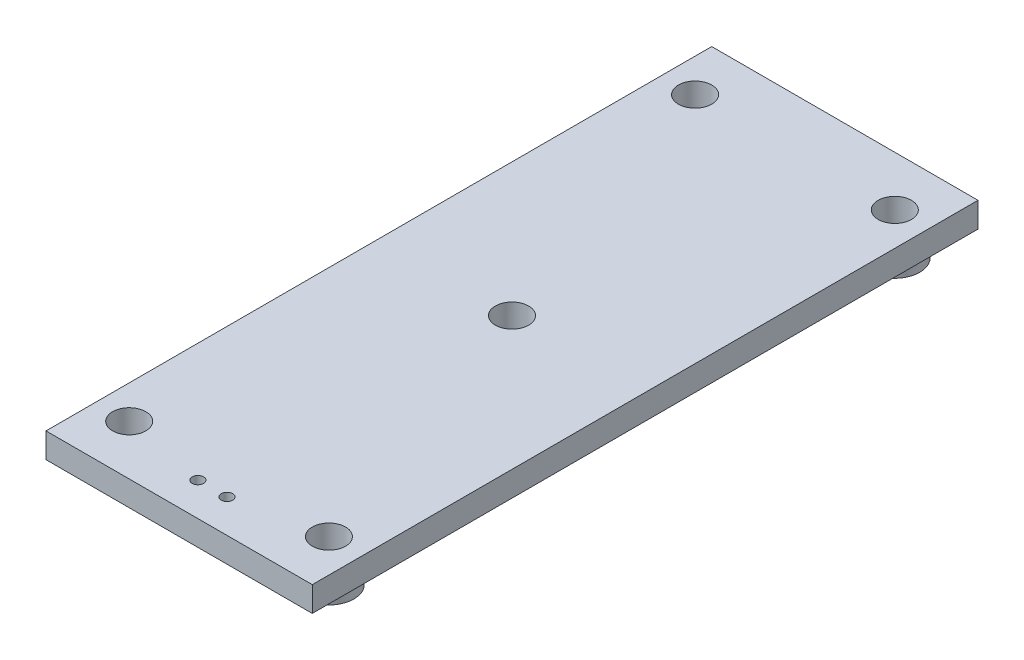
ISO-10303-21;
HEADER;
FILE_DESCRIPTION(('STEP AP214'),'2;1');
FILE_NAME('part.step','',(''),(''),'','','');
FILE_SCHEMA(('AUTOMOTIVE_DESIGN { 1 0 10303 214 1 1 1 1 }'));
ENDSEC;
DATA;
#1=APPLICATION_CONTEXT('core data for automotive mechanical design processes');
#2=APPLICATION_PROTOCOL_DEFINITION('international standard','automotive_design',2000,#1);
#3=PRODUCT_CONTEXT('',#1,'mechanical');
#4=PRODUCT('Part','Part','',(#3));
#5=PRODUCT_RELATED_PRODUCT_CATEGORY('part','',(#4));
#6=PRODUCT_DEFINITION_FORMATION('','',#4);
#7=PRODUCT_DEFINITION_CONTEXT('part definition',#1,'design');
#8=PRODUCT_DEFINITION('design','',#6,#7);
#9=PRODUCT_DEFINITION_SHAPE('','',#8);
#10=(LENGTH_UNIT() NAMED_UNIT(*) SI_UNIT(.MILLI.,.METRE.));
#11=(NAMED_UNIT(*) PLANE_ANGLE_UNIT() SI_UNIT($,.RADIAN.));
#12=(NAMED_UNIT(*) SI_UNIT($,.STERADIAN.) SOLID_ANGLE_UNIT());
#13=UNCERTAINTY_MEASURE_WITH_UNIT(LENGTH_MEASURE(1.E-05),#10,'distance_accuracy_value','');
#14=(GEOMETRIC_REPRESENTATION_CONTEXT(3) GLOBAL_UNCERTAINTY_ASSIGNED_CONTEXT((#13)) GLOBAL_UNIT_ASSIGNED_CONTEXT((#10,
#11,#12)) REPRESENTATION_CONTEXT('',''));
#15=CARTESIAN_POINT('',(0.,0.,0.));
#16=DIRECTION('',(0.,0.,1.));
#17=DIRECTION('',(1.,0.,0.));
#18=AXIS2_PLACEMENT_3D('',#15,#16,#17);
#19=CARTESIAN_POINT('',(101.6,0.,0.));
#20=DIRECTION('',(0.,-1.,0.));
#21=DIRECTION('',(0.,0.,-1.));
#22=AXIS2_PLACEMENT_3D('',#19,#20,#21);
#23=PLANE('',#22);
#24=CARTESIAN_POINT('',(-11.1125000000003,0.,482.6));
#25=DIRECTION('',(0.,-1.,0.));
#26=DIRECTION('',(0.,0.,-1.));
#27=AXIS2_PLACEMENT_3D('',#24,#25,#26);
#28=CIRCLE('',#27,4.365625);
#29=CARTESIAN_POINT('',(-11.1125000000003,0.,478.234375));
#30=VERTEX_POINT('',#29);
#31=EDGE_CURVE('E227',#30,#30,#28,.T.);
#32=ORIENTED_EDGE('',*,*,#31,.F.);
#33=EDGE_LOOP('',(#32));
#34=FACE_BOUND('',#33,.T.);
#35=CARTESIAN_POINT('',(11.1124999999996,0.,482.6));
#36=DIRECTION('',(0.,-1.,0.));
#37=DIRECTION('',(0.,0.,-1.));
#38=AXIS2_PLACEMENT_3D('',#35,#36,#37);
#39=CIRCLE('',#38,4.365625);
#40=CARTESIAN_POINT('',(11.1124999999996,0.,478.234375));
#41=VERTEX_POINT('',#40);
#42=EDGE_CURVE('E229',#41,#41,#39,.T.);
#43=ORIENTED_EDGE('',*,*,#42,.F.);
#44=EDGE_LOOP('',(#43));
#45=FACE_BOUND('',#44,.T.);
#46=CARTESIAN_POINT('',(0.,0.,254.));
#47=DIRECTION('',(0.,-1.,0.));
#48=DIRECTION('',(0.,0.,-1.));
#49=AXIS2_PLACEMENT_3D('',#46,#47,#48);
#50=CIRCLE('',#49,12.7);
#51=CARTESIAN_POINT('',(0.,0.,241.3));
#52=VERTEX_POINT('',#51);
#53=EDGE_CURVE('E240',#52,#52,#50,.T.);
#54=ORIENTED_EDGE('',*,*,#53,.F.);
#55=EDGE_LOOP('',(#54));
#56=FACE_BOUND('',#55,.T.);
#57=CARTESIAN_POINT('',(-76.2000000000001,0.,469.9));
#58=DIRECTION('',(0.,-1.,0.));
#59=DIRECTION('',(0.,0.,-1.));
#60=AXIS2_PLACEMENT_3D('',#57,#58,#59);
#61=CIRCLE('',#60,19.05);
#62=CARTESIAN_POINT('',(-76.2000000000001,0.,450.85));
#63=VERTEX_POINT('',#62);
#64=EDGE_CURVE('E11',#63,#63,#61,.T.);
#65=ORIENTED_EDGE('',*,*,#64,.F.);
#66=EDGE_LOOP('',(#65));
#67=FACE_BOUND('',#66,.T.);
#68=CARTESIAN_POINT('',(76.1999999999999,0.,469.9));
#69=DIRECTION('',(0.,-1.,0.));
#70=DIRECTION('',(0.,0.,-1.));
#71=AXIS2_PLACEMENT_3D('',#68,#69,#70);
#72=CIRCLE('',#71,19.05);
#73=CARTESIAN_POINT('',(76.1999999999999,0.,450.85));
#74=VERTEX_POINT('',#73);
#75=EDGE_CURVE('E138',#74,#74,#72,.T.);
#76=ORIENTED_EDGE('',*,*,#75,.F.);
#77=EDGE_LOOP('',(#76));
#78=FACE_BOUND('',#77,.T.);
#79=DIRECTION('',(0.,0.,1.));
#80=VECTOR('',#79,1.);
#81=CARTESIAN_POINT('',(101.6,0.,0.));
#82=LINE('',#81,#80);
#83=CARTESIAN_POINT('',(101.6,0.,0.));
#84=VERTEX_POINT('',#83);
#85=CARTESIAN_POINT('',(101.6,0.,508.));
#86=VERTEX_POINT('',#85);
#87=EDGE_CURVE('E102',#84,#86,#82,.T.);
#88=ORIENTED_EDGE('',*,*,#87,.T.);
#89=DIRECTION('',(1.,0.,0.));
#90=VECTOR('',#89,1.);
#91=CARTESIAN_POINT('',(-101.6,0.,508.));
#92=LINE('',#91,#90);
#93=CARTESIAN_POINT('',(-101.6,0.,508.));
#94=VERTEX_POINT('',#93);
#95=EDGE_CURVE('E105',#94,#86,#92,.T.);
#96=ORIENTED_EDGE('',*,*,#95,.F.);
#97=DIRECTION('',(0.,0.,-1.));
#98=VECTOR('',#97,1.);
#99=CARTESIAN_POINT('',(-101.6,0.,508.));
#100=LINE('',#99,#98);
#101=CARTESIAN_POINT('',(-101.6,0.,0.));
#102=VERTEX_POINT('',#101);
#103=EDGE_CURVE('E87',#94,#102,#100,.T.);
#104=ORIENTED_EDGE('',*,*,#103,.T.);
#105=DIRECTION('',(-1.,0.,0.));
#106=VECTOR('',#105,1.);
#107=CARTESIAN_POINT('',(101.6,0.,0.));
#108=LINE('',#107,#106);
#109=EDGE_CURVE('E109',#84,#102,#108,.T.);
#110=ORIENTED_EDGE('',*,*,#109,.F.);
#111=EDGE_LOOP('',(#88,#96,#104,#110));
#112=FACE_BOUND('',#111,.T.);
#113=CARTESIAN_POINT('',(76.1999999999999,0.,38.1));
#114=DIRECTION('',(0.,-1.,0.));
#115=DIRECTION('',(0.,0.,-1.));
#116=AXIS2_PLACEMENT_3D('',#113,#114,#115);
#117=CIRCLE('',#116,19.05);
#118=CARTESIAN_POINT('',(76.1999999999999,0.,19.05));
#119=VERTEX_POINT('',#118);
#120=EDGE_CURVE('E43',#119,#119,#117,.T.);
#121=ORIENTED_EDGE('',*,*,#120,.F.);
#122=EDGE_LOOP('',(#121));
#123=FACE_BOUND('',#122,.T.);
#124=CARTESIAN_POINT('',(-76.2000000000001,0.,38.1));
#125=DIRECTION('',(0.,-1.,0.));
#126=DIRECTION('',(0.,0.,-1.));
#127=AXIS2_PLACEMENT_3D('',#124,#125,#126);
#128=CIRCLE('',#127,19.05);
#129=CARTESIAN_POINT('',(-76.2000000000001,0.,19.05));
#130=VERTEX_POINT('',#129);
#131=EDGE_CURVE('E124',#130,#130,#128,.T.);
#132=ORIENTED_EDGE('',*,*,#131,.F.);
#133=EDGE_LOOP('',(#132));
#134=FACE_BOUND('',#133,.T.);
#135=ADVANCED_FACE('F34',(#34,#45,#56,#67,#78,#112,#123,#134),#23,.T.);
#136=CARTESIAN_POINT('',(101.6,19.05,0.));
#137=DIRECTION('',(1.,0.,0.));
#138=DIRECTION('',(0.,0.,-1.));
#139=AXIS2_PLACEMENT_3D('',#136,#137,#138);
#140=PLANE('',#139);
#141=ORIENTED_EDGE('',*,*,#87,.F.);
#142=DIRECTION('',(0.,-1.,0.));
#143=VECTOR('',#142,1.);
#144=CARTESIAN_POINT('',(101.6,19.05,0.));
#145=LINE('',#144,#143);
#146=CARTESIAN_POINT('',(101.6,19.05,0.));
#147=VERTEX_POINT('',#146);
#148=EDGE_CURVE('E51',#147,#84,#145,.T.);
#149=ORIENTED_EDGE('',*,*,#148,.F.);
#150=DIRECTION('',(0.,0.,1.));
#151=VECTOR('',#150,1.);
#152=CARTESIAN_POINT('',(101.6,19.05,0.));
#153=LINE('',#152,#151);
#154=CARTESIAN_POINT('',(101.6,19.05,508.));
#155=VERTEX_POINT('',#154);
#156=EDGE_CURVE('E94',#147,#155,#153,.T.);
#157=ORIENTED_EDGE('',*,*,#156,.T.);
#158=DIRECTION('',(0.,-1.,0.));
#159=VECTOR('',#158,1.);
#160=CARTESIAN_POINT('',(101.6,19.05,508.));
#161=LINE('',#160,#159);
#162=EDGE_CURVE('E91',#155,#86,#161,.T.);
#163=ORIENTED_EDGE('',*,*,#162,.T.);
#164=EDGE_LOOP('',(#141,#149,#157,#163));
#165=FACE_BOUND('',#164,.T.);
#166=ADVANCED_FACE('F36',(#165),#140,.T.);
#167=CARTESIAN_POINT('',(101.6,19.05,0.));
#168=DIRECTION('',(0.,0.,1.));
#169=DIRECTION('',(1.,0.,0.));
#170=AXIS2_PLACEMENT_3D('',#167,#168,#169);
#171=PLANE('',#170);
#172=ORIENTED_EDGE('',*,*,#109,.T.);
#173=DIRECTION('',(0.,-1.,0.));
#174=VECTOR('',#173,1.);
#175=CARTESIAN_POINT('',(-101.6,19.05,0.));
#176=LINE('',#175,#174);
#177=CARTESIAN_POINT('',(-101.6,19.05,0.));
#178=VERTEX_POINT('',#177);
#179=EDGE_CURVE('E69',#178,#102,#176,.T.);
#180=ORIENTED_EDGE('',*,*,#179,.F.);
#181=DIRECTION('',(-1.,0.,0.));
#182=VECTOR('',#181,1.);
#183=CARTESIAN_POINT('',(101.6,19.05,0.));
#184=LINE('',#183,#182);
#185=EDGE_CURVE('E97',#147,#178,#184,.T.);
#186=ORIENTED_EDGE('',*,*,#185,.F.);
#187=ORIENTED_EDGE('',*,*,#148,.T.);
#188=EDGE_LOOP('',(#172,#180,#186,#187));
#189=FACE_BOUND('',#188,.T.);
#190=ADVANCED_FACE('F143',(#189),#171,.F.);
#191=CARTESIAN_POINT('',(-101.6,19.05,508.));
#192=DIRECTION('',(-1.,0.,0.));
#193=DIRECTION('',(0.,0.,1.));
#194=AXIS2_PLACEMENT_3D('',#191,#192,#193);
#195=PLANE('',#194);
#196=ORIENTED_EDGE('',*,*,#103,.F.);
#197=DIRECTION('',(0.,-1.,0.));
#198=VECTOR('',#197,1.);
#199=CARTESIAN_POINT('',(-101.6,19.05,508.));
#200=LINE('',#199,#198);
#201=CARTESIAN_POINT('',(-101.6,19.05,508.));
#202=VERTEX_POINT('',#201);
#203=EDGE_CURVE('E83',#202,#94,#200,.T.);
#204=ORIENTED_EDGE('',*,*,#203,.F.);
#205=DIRECTION('',(0.,0.,-1.));
#206=VECTOR('',#205,1.);
#207=CARTESIAN_POINT('',(-101.6,19.05,508.));
#208=LINE('',#207,#206);
#209=EDGE_CURVE('E85',#202,#178,#208,.T.);
#210=ORIENTED_EDGE('',*,*,#209,.T.);
#211=ORIENTED_EDGE('',*,*,#179,.T.);
#212=EDGE_LOOP('',(#196,#204,#210,#211));
#213=FACE_BOUND('',#212,.T.);
#214=ADVANCED_FACE('F84',(#213),#195,.T.);
#215=CARTESIAN_POINT('',(-101.6,19.05,508.));
#216=DIRECTION('',(0.,0.,-1.));
#217=DIRECTION('',(-1.,0.,0.));
#218=AXIS2_PLACEMENT_3D('',#215,#216,#217);
#219=PLANE('',#218);
#220=ORIENTED_EDGE('',*,*,#95,.T.);
#221=ORIENTED_EDGE('',*,*,#162,.F.);
#222=DIRECTION('',(1.,0.,0.));
#223=VECTOR('',#222,1.);
#224=CARTESIAN_POINT('',(-101.6,19.05,508.));
#225=LINE('',#224,#223);
#226=EDGE_CURVE('E80',#202,#155,#225,.T.);
#227=ORIENTED_EDGE('',*,*,#226,.F.);
#228=ORIENTED_EDGE('',*,*,#203,.T.);
#229=EDGE_LOOP('',(#220,#221,#227,#228));
#230=FACE_BOUND('',#229,.T.);
#231=ADVANCED_FACE('F93',(#230),#219,.F.);
#232=CARTESIAN_POINT('',(101.6,19.05,0.));
#233=DIRECTION('',(0.,-1.,0.));
#234=DIRECTION('',(0.,0.,-1.));
#235=AXIS2_PLACEMENT_3D('',#232,#233,#234);
#236=PLANE('',#235);
#237=CARTESIAN_POINT('',(-11.1125000000003,19.05,482.6));
#238=DIRECTION('',(0.,-1.,0.));
#239=DIRECTION('',(0.,0.,-1.));
#240=AXIS2_PLACEMENT_3D('',#237,#238,#239);
#241=CIRCLE('',#240,4.365625);
#242=CARTESIAN_POINT('',(-11.1125000000003,19.05,478.234375));
#243=VERTEX_POINT('',#242);
#244=EDGE_CURVE('E224',#243,#243,#241,.T.);
#245=ORIENTED_EDGE('',*,*,#244,.T.);
#246=EDGE_LOOP('',(#245));
#247=FACE_BOUND('',#246,.T.);
#248=CARTESIAN_POINT('',(11.1124999999996,19.05,482.6));
#249=DIRECTION('',(0.,-1.,0.));
#250=DIRECTION('',(0.,0.,-1.));
#251=AXIS2_PLACEMENT_3D('',#248,#249,#250);
#252=CIRCLE('',#251,4.365625);
#253=CARTESIAN_POINT('',(11.1124999999996,19.05,478.234375));
#254=VERTEX_POINT('',#253);
#255=EDGE_CURVE('E232',#254,#254,#252,.T.);
#256=ORIENTED_EDGE('',*,*,#255,.T.);
#257=EDGE_LOOP('',(#256));
#258=FACE_BOUND('',#257,.T.);
#259=CARTESIAN_POINT('',(0.,19.05,254.));
#260=DIRECTION('',(0.,1.,0.));
#261=DIRECTION('',(0.,0.,1.));
#262=AXIS2_PLACEMENT_3D('',#259,#260,#261);
#263=CIRCLE('',#262,12.7);
#264=CARTESIAN_POINT('',(0.,19.05,266.7));
#265=VERTEX_POINT('',#264);
#266=EDGE_CURVE('E235',#265,#265,#263,.T.);
#267=ORIENTED_EDGE('',*,*,#266,.F.);
#268=EDGE_LOOP('',(#267));
#269=FACE_BOUND('',#268,.T.);
#270=CARTESIAN_POINT('',(-76.2000000000001,19.05,38.1));
#271=DIRECTION('',(0.,-1.,0.));
#272=DIRECTION('',(0.,0.,-1.));
#273=AXIS2_PLACEMENT_3D('',#270,#271,#272);
#274=CIRCLE('',#273,12.7);
#275=CARTESIAN_POINT('',(-76.2000000000001,19.05,25.4));
#276=VERTEX_POINT('',#275);
#277=EDGE_CURVE('E244',#276,#276,#274,.T.);
#278=ORIENTED_EDGE('',*,*,#277,.T.);
#279=EDGE_LOOP('',(#278));
#280=FACE_BOUND('',#279,.T.);
#281=CARTESIAN_POINT('',(76.1999999999999,19.05,38.1));
#282=DIRECTION('',(0.,-1.,0.));
#283=DIRECTION('',(0.,0.,-1.));
#284=AXIS2_PLACEMENT_3D('',#281,#282,#283);
#285=CIRCLE('',#284,12.7);
#286=CARTESIAN_POINT('',(76.1999999999999,19.05,25.4));
#287=VERTEX_POINT('',#286);
#288=EDGE_CURVE('E250',#287,#287,#285,.T.);
#289=ORIENTED_EDGE('',*,*,#288,.T.);
#290=EDGE_LOOP('',(#289));
#291=FACE_BOUND('',#290,.T.);
#292=CARTESIAN_POINT('',(-76.2000000000001,19.05,469.9));
#293=DIRECTION('',(0.,-1.,0.));
#294=DIRECTION('',(0.,0.,-1.));
#295=AXIS2_PLACEMENT_3D('',#292,#293,#294);
#296=CIRCLE('',#295,12.7);
#297=CARTESIAN_POINT('',(-76.2000000000001,19.05,457.2));
#298=VERTEX_POINT('',#297);
#299=EDGE_CURVE('E256',#298,#298,#296,.T.);
#300=ORIENTED_EDGE('',*,*,#299,.T.);
#301=EDGE_LOOP('',(#300));
#302=FACE_BOUND('',#301,.T.);
#303=CARTESIAN_POINT('',(76.1999999999999,19.05,469.9));
#304=DIRECTION('',(0.,-1.,0.));
#305=DIRECTION('',(0.,0.,-1.));
#306=AXIS2_PLACEMENT_3D('',#303,#304,#305);
#307=CIRCLE('',#306,12.7);
#308=CARTESIAN_POINT('',(76.1999999999999,19.05,457.2));
#309=VERTEX_POINT('',#308);
#310=EDGE_CURVE('E133',#309,#309,#307,.T.);
#311=ORIENTED_EDGE('',*,*,#310,.T.);
#312=EDGE_LOOP('',(#311));
#313=FACE_BOUND('',#312,.T.);
#314=ORIENTED_EDGE('',*,*,#156,.F.);
#315=ORIENTED_EDGE('',*,*,#185,.T.);
#316=ORIENTED_EDGE('',*,*,#209,.F.);
#317=ORIENTED_EDGE('',*,*,#226,.T.);
#318=EDGE_LOOP('',(#314,#315,#316,#317));
#319=FACE_BOUND('',#318,.T.);
#320=ADVANCED_FACE('F96',(#247,#258,#269,#280,#291,#302,#313,#319),#236,.F.);
#321=CARTESIAN_POINT('',(76.1999999999999,-12.7,469.9));
#322=DIRECTION('',(0.,1.,0.));
#323=DIRECTION('',(0.,0.,1.));
#324=AXIS2_PLACEMENT_3D('',#321,#322,#323);
#325=CYLINDRICAL_SURFACE('',#324,19.05);
#326=CARTESIAN_POINT('',(76.1999999999999,-12.7,469.9));
#327=DIRECTION('',(0.,-1.,0.));
#328=DIRECTION('',(0.,0.,-1.));
#329=AXIS2_PLACEMENT_3D('',#326,#327,#328);
#330=CIRCLE('',#329,19.05);
#331=CARTESIAN_POINT('',(76.1999999999999,-12.7,450.85));
#332=VERTEX_POINT('',#331);
#333=EDGE_CURVE('E106',#332,#332,#330,.T.);
#334=ORIENTED_EDGE('',*,*,#333,.F.);
#335=EDGE_LOOP('',(#334));
#336=FACE_BOUND('',#335,.T.);
#337=ORIENTED_EDGE('',*,*,#75,.T.);
#338=EDGE_LOOP('',(#337));
#339=FACE_BOUND('',#338,.T.);
#340=ADVANCED_FACE('F156',(#336,#339),#325,.T.);
#341=CARTESIAN_POINT('',(76.1999999999999,-12.7,469.9));
#342=DIRECTION('',(0.,-1.,0.));
#343=DIRECTION('',(0.,0.,-1.));
#344=AXIS2_PLACEMENT_3D('',#341,#342,#343);
#345=PLANE('',#344);
#346=CARTESIAN_POINT('',(76.1999999999999,-12.7,469.9));
#347=DIRECTION('',(0.,-1.,0.));
#348=DIRECTION('',(0.,0.,-1.));
#349=AXIS2_PLACEMENT_3D('',#346,#347,#348);
#350=CIRCLE('',#349,12.7);
#351=CARTESIAN_POINT('',(76.1999999999999,-12.7,457.2));
#352=VERTEX_POINT('',#351);
#353=EDGE_CURVE('E259',#352,#352,#350,.T.);
#354=ORIENTED_EDGE('',*,*,#353,.F.);
#355=EDGE_LOOP('',(#354));
#356=FACE_BOUND('',#355,.T.);
#357=ORIENTED_EDGE('',*,*,#333,.T.);
#358=EDGE_LOOP('',(#357));
#359=FACE_BOUND('',#358,.T.);
#360=ADVANCED_FACE('F161',(#356,#359),#345,.T.);
#361=CARTESIAN_POINT('',(76.1999999999999,-12.7,38.1));
#362=DIRECTION('',(0.,1.,0.));
#363=DIRECTION('',(0.,0.,1.));
#364=AXIS2_PLACEMENT_3D('',#361,#362,#363);
#365=CYLINDRICAL_SURFACE('',#364,19.05);
#366=CARTESIAN_POINT('',(76.1999999999999,-12.7,38.1));
#367=DIRECTION('',(0.,1.,0.));
#368=DIRECTION('',(0.,0.,1.));
#369=AXIS2_PLACEMENT_3D('',#366,#367,#368);
#370=CIRCLE('',#369,19.05);
#371=CARTESIAN_POINT('',(76.1999999999999,-12.7,57.15));
#372=VERTEX_POINT('',#371);
#373=EDGE_CURVE('E130',#372,#372,#370,.T.);
#374=ORIENTED_EDGE('',*,*,#373,.T.);
#375=EDGE_LOOP('',(#374));
#376=FACE_BOUND('',#375,.T.);
#377=ORIENTED_EDGE('',*,*,#120,.T.);
#378=EDGE_LOOP('',(#377));
#379=FACE_BOUND('',#378,.T.);
#380=ADVANCED_FACE('F116',(#376,#379),#365,.T.);
#381=CARTESIAN_POINT('',(76.1999999999999,-12.7,38.1));
#382=DIRECTION('',(0.,1.,0.));
#383=DIRECTION('',(0.,0.,1.));
#384=AXIS2_PLACEMENT_3D('',#381,#382,#383);
#385=PLANE('',#384);
#386=CARTESIAN_POINT('',(76.1999999999999,-12.7,38.1));
#387=DIRECTION('',(0.,-1.,0.));
#388=DIRECTION('',(0.,0.,-1.));
#389=AXIS2_PLACEMENT_3D('',#386,#387,#388);
#390=CIRCLE('',#389,12.7);
#391=CARTESIAN_POINT('',(76.1999999999999,-12.7,25.4));
#392=VERTEX_POINT('',#391);
#393=EDGE_CURVE('E247',#392,#392,#390,.T.);
#394=ORIENTED_EDGE('',*,*,#393,.F.);
#395=EDGE_LOOP('',(#394));
#396=FACE_BOUND('',#395,.T.);
#397=ORIENTED_EDGE('',*,*,#373,.F.);
#398=EDGE_LOOP('',(#397));
#399=FACE_BOUND('',#398,.T.);
#400=ADVANCED_FACE('F172',(#396,#399),#385,.F.);
#401=CARTESIAN_POINT('',(-76.2000000000001,-12.7,38.1));
#402=DIRECTION('',(0.,1.,0.));
#403=DIRECTION('',(0.,0.,1.));
#404=AXIS2_PLACEMENT_3D('',#401,#402,#403);
#405=CYLINDRICAL_SURFACE('',#404,19.05);
#406=CARTESIAN_POINT('',(-76.2000000000001,-12.7,38.1));
#407=DIRECTION('',(0.,-1.,0.));
#408=DIRECTION('',(0.,0.,-1.));
#409=AXIS2_PLACEMENT_3D('',#406,#407,#408);
#410=CIRCLE('',#409,19.05);
#411=CARTESIAN_POINT('',(-76.2000000000001,-12.7,19.05));
#412=VERTEX_POINT('',#411);
#413=EDGE_CURVE('E126',#412,#412,#410,.T.);
#414=ORIENTED_EDGE('',*,*,#413,.F.);
#415=EDGE_LOOP('',(#414));
#416=FACE_BOUND('',#415,.T.);
#417=ORIENTED_EDGE('',*,*,#131,.T.);
#418=EDGE_LOOP('',(#417));
#419=FACE_BOUND('',#418,.T.);
#420=ADVANCED_FACE('F176',(#416,#419),#405,.T.);
#421=CARTESIAN_POINT('',(-76.2000000000001,-12.7,38.1));
#422=DIRECTION('',(0.,-1.,0.));
#423=DIRECTION('',(0.,0.,-1.));
#424=AXIS2_PLACEMENT_3D('',#421,#422,#423);
#425=PLANE('',#424);
#426=CARTESIAN_POINT('',(-76.2000000000001,-12.7,38.1));
#427=DIRECTION('',(0.,-1.,0.));
#428=DIRECTION('',(0.,0.,-1.));
#429=AXIS2_PLACEMENT_3D('',#426,#427,#428);
#430=CIRCLE('',#429,12.7);
#431=CARTESIAN_POINT('',(-76.2000000000001,-12.7,25.4));
#432=VERTEX_POINT('',#431);
#433=EDGE_CURVE('E243',#432,#432,#430,.T.);
#434=ORIENTED_EDGE('',*,*,#433,.F.);
#435=EDGE_LOOP('',(#434));
#436=FACE_BOUND('',#435,.T.);
#437=ORIENTED_EDGE('',*,*,#413,.T.);
#438=EDGE_LOOP('',(#437));
#439=FACE_BOUND('',#438,.T.);
#440=ADVANCED_FACE('F180',(#436,#439),#425,.T.);
#441=CARTESIAN_POINT('',(-76.2000000000001,-12.7,469.9));
#442=DIRECTION('',(0.,1.,0.));
#443=DIRECTION('',(0.,0.,1.));
#444=AXIS2_PLACEMENT_3D('',#441,#442,#443);
#445=CYLINDRICAL_SURFACE('',#444,19.05);
#446=CARTESIAN_POINT('',(-76.2000000000001,-12.7,469.9));
#447=DIRECTION('',(0.,1.,0.));
#448=DIRECTION('',(0.,0.,1.));
#449=AXIS2_PLACEMENT_3D('',#446,#447,#448);
#450=CIRCLE('',#449,19.05);
#451=CARTESIAN_POINT('',(-76.2000000000001,-12.7,488.95));
#452=VERTEX_POINT('',#451);
#453=EDGE_CURVE('E127',#452,#452,#450,.T.);
#454=ORIENTED_EDGE('',*,*,#453,.T.);
#455=EDGE_LOOP('',(#454));
#456=FACE_BOUND('',#455,.T.);
#457=ORIENTED_EDGE('',*,*,#64,.T.);
#458=EDGE_LOOP('',(#457));
#459=FACE_BOUND('',#458,.T.);
#460=ADVANCED_FACE('F184',(#456,#459),#445,.T.);
#461=CARTESIAN_POINT('',(-76.2000000000001,-12.7,469.9));
#462=DIRECTION('',(0.,1.,0.));
#463=DIRECTION('',(0.,0.,1.));
#464=AXIS2_PLACEMENT_3D('',#461,#462,#463);
#465=PLANE('',#464);
#466=CARTESIAN_POINT('',(-76.2000000000001,-12.7,469.9));
#467=DIRECTION('',(0.,-1.,0.));
#468=DIRECTION('',(0.,0.,-1.));
#469=AXIS2_PLACEMENT_3D('',#466,#467,#468);
#470=CIRCLE('',#469,12.7);
#471=CARTESIAN_POINT('',(-76.2000000000001,-12.7,457.2));
#472=VERTEX_POINT('',#471);
#473=EDGE_CURVE('E253',#472,#472,#470,.T.);
#474=ORIENTED_EDGE('',*,*,#473,.F.);
#475=EDGE_LOOP('',(#474));
#476=FACE_BOUND('',#475,.T.);
#477=ORIENTED_EDGE('',*,*,#453,.F.);
#478=EDGE_LOOP('',(#477));
#479=FACE_BOUND('',#478,.T.);
#480=ADVANCED_FACE('F188',(#476,#479),#465,.F.);
#481=CARTESIAN_POINT('',(76.1999999999999,19.05,469.9));
#482=DIRECTION('',(0.,-1.,0.));
#483=DIRECTION('',(0.,0.,-1.));
#484=AXIS2_PLACEMENT_3D('',#481,#482,#483);
#485=CYLINDRICAL_SURFACE('',#484,12.7);
#486=ORIENTED_EDGE('',*,*,#310,.F.);
#487=EDGE_LOOP('',(#486));
#488=FACE_BOUND('',#487,.T.);
#489=ORIENTED_EDGE('',*,*,#353,.T.);
#490=EDGE_LOOP('',(#489));
#491=FACE_BOUND('',#490,.T.);
#492=ADVANCED_FACE('F192',(#488,#491),#485,.F.);
#493=CARTESIAN_POINT('',(-76.2000000000001,19.05,469.9));
#494=DIRECTION('',(0.,-1.,0.));
#495=DIRECTION('',(0.,0.,-1.));
#496=AXIS2_PLACEMENT_3D('',#493,#494,#495);
#497=CYLINDRICAL_SURFACE('',#496,12.7);
#498=ORIENTED_EDGE('',*,*,#299,.F.);
#499=EDGE_LOOP('',(#498));
#500=FACE_BOUND('',#499,.T.);
#501=ORIENTED_EDGE('',*,*,#473,.T.);
#502=EDGE_LOOP('',(#501));
#503=FACE_BOUND('',#502,.T.);
#504=ADVANCED_FACE('F196',(#500,#503),#497,.F.);
#505=CARTESIAN_POINT('',(76.1999999999999,19.05,38.1));
#506=DIRECTION('',(0.,-1.,0.));
#507=DIRECTION('',(0.,0.,-1.));
#508=AXIS2_PLACEMENT_3D('',#505,#506,#507);
#509=CYLINDRICAL_SURFACE('',#508,12.7);
#510=ORIENTED_EDGE('',*,*,#288,.F.);
#511=EDGE_LOOP('',(#510));
#512=FACE_BOUND('',#511,.T.);
#513=ORIENTED_EDGE('',*,*,#393,.T.);
#514=EDGE_LOOP('',(#513));
#515=FACE_BOUND('',#514,.T.);
#516=ADVANCED_FACE('F200',(#512,#515),#509,.F.);
#517=CARTESIAN_POINT('',(-76.2000000000001,19.05,38.1));
#518=DIRECTION('',(0.,-1.,0.));
#519=DIRECTION('',(0.,0.,-1.));
#520=AXIS2_PLACEMENT_3D('',#517,#518,#519);
#521=CYLINDRICAL_SURFACE('',#520,12.7);
#522=ORIENTED_EDGE('',*,*,#277,.F.);
#523=EDGE_LOOP('',(#522));
#524=FACE_BOUND('',#523,.T.);
#525=ORIENTED_EDGE('',*,*,#433,.T.);
#526=EDGE_LOOP('',(#525));
#527=FACE_BOUND('',#526,.T.);
#528=ADVANCED_FACE('F204',(#524,#527),#521,.F.);
#529=CARTESIAN_POINT('',(0.,-12.7,254.));
#530=DIRECTION('',(0.,1.,0.));
#531=DIRECTION('',(0.,0.,1.));
#532=AXIS2_PLACEMENT_3D('',#529,#530,#531);
#533=CYLINDRICAL_SURFACE('',#532,12.7);
#534=ORIENTED_EDGE('',*,*,#53,.T.);
#535=EDGE_LOOP('',(#534));
#536=FACE_BOUND('',#535,.T.);
#537=ORIENTED_EDGE('',*,*,#266,.T.);
#538=EDGE_LOOP('',(#537));
#539=FACE_BOUND('',#538,.T.);
#540=ADVANCED_FACE('F208',(#536,#539),#533,.F.);
#541=CARTESIAN_POINT('',(11.1124999999996,19.05,482.6));
#542=DIRECTION('',(0.,-1.,0.));
#543=DIRECTION('',(0.,0.,-1.));
#544=AXIS2_PLACEMENT_3D('',#541,#542,#543);
#545=CYLINDRICAL_SURFACE('',#544,4.365625);
#546=CARTESIAN_POINT('',(11.1124999999996,19.05,478.234375));
#547=CARTESIAN_POINT('',(11.1124999999996,18.8515625,478.234375));
#548=CARTESIAN_POINT('',(11.1124999999996,18.653125,478.234375));
#549=CARTESIAN_POINT('',(11.1124999999996,18.25625,478.234375));
#550=CARTESIAN_POINT('',(11.1124999999996,18.0578125,478.234375));
#551=CARTESIAN_POINT('',(11.1124999999996,17.6609375,478.234375));
#552=CARTESIAN_POINT('',(11.1124999999996,17.4625,478.234375));
#553=CARTESIAN_POINT('',(11.1124999999996,17.065625,478.234375));
#554=CARTESIAN_POINT('',(11.1124999999996,16.8671875,478.234375));
#555=CARTESIAN_POINT('',(11.1124999999996,16.4703125,478.234375));
#556=CARTESIAN_POINT('',(11.1124999999996,16.271875,478.234375));
#557=CARTESIAN_POINT('',(11.1124999999996,15.875,478.234375));
#558=CARTESIAN_POINT('',(11.1124999999996,15.6765625,478.234375));
#559=CARTESIAN_POINT('',(11.1124999999996,15.2796875,478.234375));
#560=CARTESIAN_POINT('',(11.1124999999996,15.08125,478.234375));
#561=CARTESIAN_POINT('',(11.1124999999996,14.684375,478.234375));
#562=CARTESIAN_POINT('',(11.1124999999996,14.4859375,478.234375));
#563=CARTESIAN_POINT('',(11.1124999999996,14.0890625,478.234375));
#564=CARTESIAN_POINT('',(11.1124999999996,13.890625,478.234375));
#565=CARTESIAN_POINT('',(11.1124999999996,13.49375,478.234375));
#566=CARTESIAN_POINT('',(11.1124999999996,13.2953125,478.234375));
#567=CARTESIAN_POINT('',(11.1124999999996,12.8984375,478.234375));
#568=CARTESIAN_POINT('',(11.1124999999996,12.7,478.234375));
#569=CARTESIAN_POINT('',(11.1124999999996,12.303125,478.234375));
#570=CARTESIAN_POINT('',(11.1124999999996,12.1046875,478.234375));
#571=CARTESIAN_POINT('',(11.1124999999996,11.7078125,478.234375));
#572=CARTESIAN_POINT('',(11.1124999999996,11.509375,478.234375));
#573=CARTESIAN_POINT('',(11.1124999999996,11.1125,478.234375));
#574=CARTESIAN_POINT('',(11.1124999999996,10.9140625,478.234375));
#575=CARTESIAN_POINT('',(11.1124999999996,10.5171875,478.234375));
#576=CARTESIAN_POINT('',(11.1124999999996,10.31875,478.234375));
#577=CARTESIAN_POINT('',(11.1124999999996,9.921875,478.234375));
#578=CARTESIAN_POINT('',(11.1124999999996,9.7234375,478.234375));
#579=CARTESIAN_POINT('',(11.1124999999996,9.3265625,478.234375));
#580=CARTESIAN_POINT('',(11.1124999999996,9.128125,478.234375));
#581=CARTESIAN_POINT('',(11.1124999999996,8.73125,478.234375));
#582=CARTESIAN_POINT('',(11.1124999999996,8.5328125,478.234375));
#583=CARTESIAN_POINT('',(11.1124999999996,8.1359375,478.234375));
#584=CARTESIAN_POINT('',(11.1124999999996,7.9375,478.234375));
#585=CARTESIAN_POINT('',(11.1124999999996,7.540625,478.234375));
#586=CARTESIAN_POINT('',(11.1124999999996,7.3421875,478.234375));
#587=CARTESIAN_POINT('',(11.1124999999996,6.9453125,478.234375));
#588=CARTESIAN_POINT('',(11.1124999999996,6.746875,478.234375));
#589=CARTESIAN_POINT('',(11.1124999999996,6.35,478.234375));
#590=CARTESIAN_POINT('',(11.1124999999996,6.1515625,478.234375));
#591=CARTESIAN_POINT('',(11.1124999999996,5.7546875,478.234375));
#592=CARTESIAN_POINT('',(11.1124999999996,5.55625,478.234375));
#593=CARTESIAN_POINT('',(11.1124999999996,5.159375,478.234375));
#594=CARTESIAN_POINT('',(11.1124999999996,4.9609375,478.234375));
#595=CARTESIAN_POINT('',(11.1124999999996,4.5640625,478.234375));
#596=CARTESIAN_POINT('',(11.1124999999996,4.365625,478.234375));
#597=CARTESIAN_POINT('',(11.1124999999996,3.96875,478.234375));
#598=CARTESIAN_POINT('',(11.1124999999996,3.7703125,478.234375));
#599=CARTESIAN_POINT('',(11.1124999999996,3.3734375,478.234375));
#600=CARTESIAN_POINT('',(11.1124999999996,3.175,478.234375));
#601=CARTESIAN_POINT('',(11.1124999999996,2.778125,478.234375));
#602=CARTESIAN_POINT('',(11.1124999999996,2.5796875,478.234375));
#603=CARTESIAN_POINT('',(11.1124999999996,2.1828125,478.234375));
#604=CARTESIAN_POINT('',(11.1124999999996,1.984375,478.234375));
#605=CARTESIAN_POINT('',(11.1124999999996,1.5875,478.234375));
#606=CARTESIAN_POINT('',(11.1124999999996,1.3890625,478.234375));
#607=CARTESIAN_POINT('',(11.1124999999996,0.992187500000001,478.234375));
#608=CARTESIAN_POINT('',(11.1124999999996,0.793750000000001,478.234375));
#609=CARTESIAN_POINT('',(11.1124999999996,0.396875,478.234375));
#610=CARTESIAN_POINT('',(11.1124999999996,0.1984375,478.234375));
#611=CARTESIAN_POINT('',(11.1124999999996,0.,478.234375));
#612=B_SPLINE_CURVE_WITH_KNOTS('',3,(#546,#547,#548,#549,#550,#551,#552,#553,#554,#555,#556,
#557,#558,#559,#560,#561,#562,#563,#564,#565,#566,#567,#568,#569,#570,#571,#572,#573,#574,#575,
#576,#577,#578,#579,#580,#581,#582,#583,#584,#585,#586,#587,#588,#589,#590,#591,#592,#593,#594,
#595,#596,#597,#598,#599,#600,#601,#602,#603,#604,#605,#606,#607,#608,#609,#610,#611),
.UNSPECIFIED.,.F.,.F.,(4,2,2,2,2,2,2,2,2,2,2,2,2,2,2,2,2,2,2,2,2,2,2,2,2,2,2,2,2,2,2,2,4),(0.,
0.5953125,1.190625,1.7859375,2.38125,2.9765625,3.571875,4.1671875,4.7625,5.3578125,5.953125,
6.5484375,7.14375,7.7390625,8.334375,8.9296875,9.525,10.1203125,10.715625,11.3109375,11.90625,
12.5015625,13.096875,13.6921875,14.2875,14.8828125,15.478125,16.0734375,16.66875,17.2640625,
17.859375,18.4546875,19.05),.UNSPECIFIED.);
#613=EDGE_CURVE('BSEAM212',#254,#41,#612,.T.);
#614=ORIENTED_EDGE('',*,*,#255,.F.);
#615=ORIENTED_EDGE('',*,*,#42,.T.);
#616=ORIENTED_EDGE('',*,*,#613,.T.);
#617=ORIENTED_EDGE('',*,*,#613,.F.);
#618=EDGE_LOOP('',(#614,#616,#615,#617));
#619=FACE_BOUND('',#618,.T.);
#620=ADVANCED_FACE('F212',(#619),#545,.F.);
#621=CARTESIAN_POINT('',(-11.1125000000003,19.05,482.6));
#622=DIRECTION('',(0.,-1.,0.));
#623=DIRECTION('',(0.,0.,-1.));
#624=AXIS2_PLACEMENT_3D('',#621,#622,#623);
#625=CYLINDRICAL_SURFACE('',#624,4.365625);
#626=CARTESIAN_POINT('',(-11.1125000000003,19.05,478.234375));
#627=CARTESIAN_POINT('',(-11.1125000000003,18.8515625,478.234375));
#628=CARTESIAN_POINT('',(-11.1125000000003,18.653125,478.234375));
#629=CARTESIAN_POINT('',(-11.1125000000003,18.25625,478.234375));
#630=CARTESIAN_POINT('',(-11.1125000000003,18.0578125,478.234375));
#631=CARTESIAN_POINT('',(-11.1125000000003,17.6609375,478.234375));
#632=CARTESIAN_POINT('',(-11.1125000000003,17.4625,478.234375));
#633=CARTESIAN_POINT('',(-11.1125000000003,17.065625,478.234375));
#634=CARTESIAN_POINT('',(-11.1125000000003,16.8671875,478.234375));
#635=CARTESIAN_POINT('',(-11.1125000000003,16.4703125,478.234375));
#636=CARTESIAN_POINT('',(-11.1125000000003,16.271875,478.234375));
#637=CARTESIAN_POINT('',(-11.1125000000003,15.875,478.234375));
#638=CARTESIAN_POINT('',(-11.1125000000003,15.6765625,478.234375));
#639=CARTESIAN_POINT('',(-11.1125000000003,15.2796875,478.234375));
#640=CARTESIAN_POINT('',(-11.1125000000003,15.08125,478.234375));
#641=CARTESIAN_POINT('',(-11.1125000000003,14.684375,478.234375));
#642=CARTESIAN_POINT('',(-11.1125000000003,14.4859375,478.234375));
#643=CARTESIAN_POINT('',(-11.1125000000003,14.0890625,478.234375));
#644=CARTESIAN_POINT('',(-11.1125000000003,13.890625,478.234375));
#645=CARTESIAN_POINT('',(-11.1125000000003,13.49375,478.234375));
#646=CARTESIAN_POINT('',(-11.1125000000003,13.2953125,478.234375));
#647=CARTESIAN_POINT('',(-11.1125000000003,12.8984375,478.234375));
#648=CARTESIAN_POINT('',(-11.1125000000003,12.7,478.234375));
#649=CARTESIAN_POINT('',(-11.1125000000003,12.303125,478.234375));
#650=CARTESIAN_POINT('',(-11.1125000000003,12.1046875,478.234375));
#651=CARTESIAN_POINT('',(-11.1125000000003,11.7078125,478.234375));
#652=CARTESIAN_POINT('',(-11.1125000000003,11.509375,478.234375));
#653=CARTESIAN_POINT('',(-11.1125000000003,11.1125,478.234375));
#654=CARTESIAN_POINT('',(-11.1125000000003,10.9140625,478.234375));
#655=CARTESIAN_POINT('',(-11.1125000000003,10.5171875,478.234375));
#656=CARTESIAN_POINT('',(-11.1125000000003,10.31875,478.234375));
#657=CARTESIAN_POINT('',(-11.1125000000003,9.921875,478.234375));
#658=CARTESIAN_POINT('',(-11.1125000000003,9.7234375,478.234375));
#659=CARTESIAN_POINT('',(-11.1125000000003,9.3265625,478.234375));
#660=CARTESIAN_POINT('',(-11.1125000000003,9.128125,478.234375));
#661=CARTESIAN_POINT('',(-11.1125000000003,8.73125,478.234375));
#662=CARTESIAN_POINT('',(-11.1125000000003,8.5328125,478.234375));
#663=CARTESIAN_POINT('',(-11.1125000000003,8.1359375,478.234375));
#664=CARTESIAN_POINT('',(-11.1125000000003,7.9375,478.234375));
#665=CARTESIAN_POINT('',(-11.1125000000003,7.540625,478.234375));
#666=CARTESIAN_POINT('',(-11.1125000000003,7.3421875,478.234375));
#667=CARTESIAN_POINT('',(-11.1125000000003,6.9453125,478.234375));
#668=CARTESIAN_POINT('',(-11.1125000000003,6.746875,478.234375));
#669=CARTESIAN_POINT('',(-11.1125000000003,6.35,478.234375));
#670=CARTESIAN_POINT('',(-11.1125000000003,6.1515625,478.234375));
#671=CARTESIAN_POINT('',(-11.1125000000003,5.7546875,478.234375));
#672=CARTESIAN_POINT('',(-11.1125000000003,5.55625,478.234375));
#673=CARTESIAN_POINT('',(-11.1125000000003,5.159375,478.234375));
#674=CARTESIAN_POINT('',(-11.1125000000003,4.9609375,478.234375));
#675=CARTESIAN_POINT('',(-11.1125000000003,4.5640625,478.234375));
#676=CARTESIAN_POINT('',(-11.1125000000003,4.365625,478.234375));
#677=CARTESIAN_POINT('',(-11.1125000000003,3.96875,478.234375));
#678=CARTESIAN_POINT('',(-11.1125000000003,3.7703125,478.234375));
#679=CARTESIAN_POINT('',(-11.1125000000003,3.3734375,478.234375));
#680=CARTESIAN_POINT('',(-11.1125000000003,3.175,478.234375));
#681=CARTESIAN_POINT('',(-11.1125000000003,2.778125,478.234375));
#682=CARTESIAN_POINT('',(-11.1125000000003,2.5796875,478.234375));
#683=CARTESIAN_POINT('',(-11.1125000000003,2.1828125,478.234375));
#684=CARTESIAN_POINT('',(-11.1125000000003,1.984375,478.234375));
#685=CARTESIAN_POINT('',(-11.1125000000003,1.5875,478.234375));
#686=CARTESIAN_POINT('',(-11.1125000000003,1.3890625,478.234375));
#687=CARTESIAN_POINT('',(-11.1125000000003,0.992187500000001,478.234375));
#688=CARTESIAN_POINT('',(-11.1125000000003,0.793750000000001,478.234375));
#689=CARTESIAN_POINT('',(-11.1125000000003,0.396875,478.234375));
#690=CARTESIAN_POINT('',(-11.1125000000003,0.1984375,478.234375));
#691=CARTESIAN_POINT('',(-11.1125000000003,0.,478.234375));
#692=B_SPLINE_CURVE_WITH_KNOTS('',3,(#626,#627,#628,#629,#630,#631,#632,#633,#634,#635,#636,
#637,#638,#639,#640,#641,#642,#643,#644,#645,#646,#647,#648,#649,#650,#651,#652,#653,#654,#655,
#656,#657,#658,#659,#660,#661,#662,#663,#664,#665,#666,#667,#668,#669,#670,#671,#672,#673,#674,
#675,#676,#677,#678,#679,#680,#681,#682,#683,#684,#685,#686,#687,#688,#689,#690,#691),
.UNSPECIFIED.,.F.,.F.,(4,2,2,2,2,2,2,2,2,2,2,2,2,2,2,2,2,2,2,2,2,2,2,2,2,2,2,2,2,2,2,2,4),(0.,
0.5953125,1.190625,1.7859375,2.38125,2.9765625,3.571875,4.1671875,4.7625,5.3578125,5.953125,
6.5484375,7.14375,7.7390625,8.334375,8.9296875,9.525,10.1203125,10.715625,11.3109375,11.90625,
12.5015625,13.096875,13.6921875,14.2875,14.8828125,15.478125,16.0734375,16.66875,17.2640625,
17.859375,18.4546875,19.05),.UNSPECIFIED.);
#693=EDGE_CURVE('BSEAM216',#243,#30,#692,.T.);
#694=ORIENTED_EDGE('',*,*,#244,.F.);
#695=ORIENTED_EDGE('',*,*,#31,.T.);
#696=ORIENTED_EDGE('',*,*,#693,.T.);
#697=ORIENTED_EDGE('',*,*,#693,.F.);
#698=EDGE_LOOP('',(#694,#696,#695,#697));
#699=FACE_BOUND('',#698,.T.);
#700=ADVANCED_FACE('F216',(#699),#625,.F.);
#701=CLOSED_SHELL('',(#135,#166,#190,#214,#231,#320,#340,#360,#380,#400,#420,#440,#460,#480,
#492,#504,#516,#528,#540,#620,#700));
#702=MANIFOLD_SOLID_BREP('B2',#701);
#703=ADVANCED_BREP_SHAPE_REPRESENTATION('',(#18,#702),#14);
#704=SHAPE_DEFINITION_REPRESENTATION(#9,#703);
ENDSEC;
END-ISO-10303-21;
